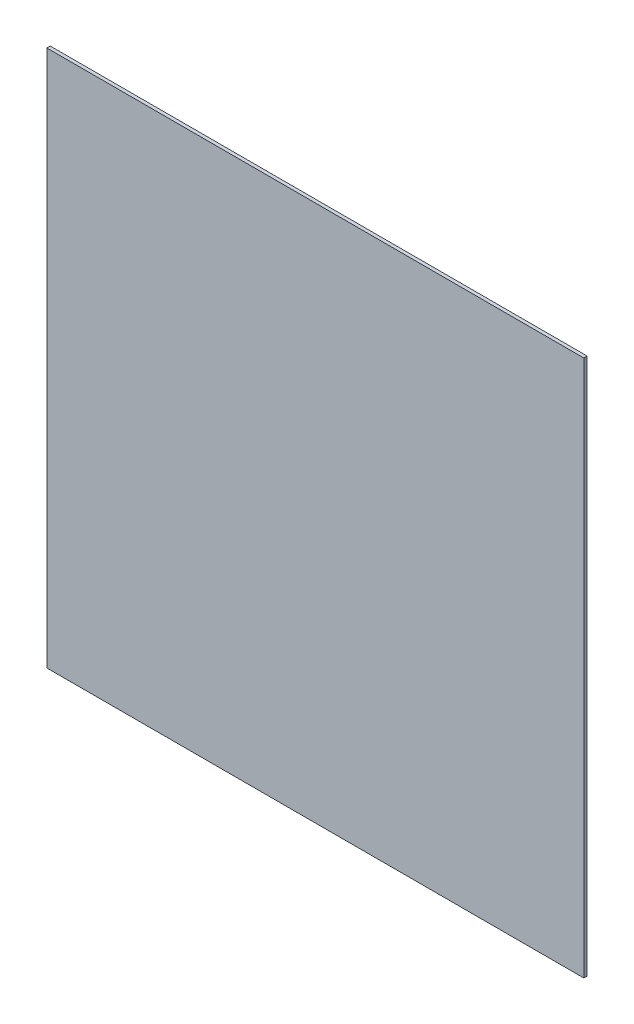
ISO-10303-21;
HEADER;
FILE_DESCRIPTION(('STEP AP214'),'2;1');
FILE_NAME('part.step','',(''),(''),'','','');
FILE_SCHEMA(('AUTOMOTIVE_DESIGN { 1 0 10303 214 1 1 1 1 }'));
ENDSEC;
DATA;
#1=APPLICATION_CONTEXT('core data for automotive mechanical design processes');
#2=APPLICATION_PROTOCOL_DEFINITION('international standard','automotive_design',2000,#1);
#3=PRODUCT_CONTEXT('',#1,'mechanical');
#4=PRODUCT('Part','Part','',(#3));
#5=PRODUCT_RELATED_PRODUCT_CATEGORY('part','',(#4));
#6=PRODUCT_DEFINITION_FORMATION('','',#4);
#7=PRODUCT_DEFINITION_CONTEXT('part definition',#1,'design');
#8=PRODUCT_DEFINITION('design','',#6,#7);
#9=PRODUCT_DEFINITION_SHAPE('','',#8);
#10=(LENGTH_UNIT() NAMED_UNIT(*) SI_UNIT(.MILLI.,.METRE.));
#11=(NAMED_UNIT(*) PLANE_ANGLE_UNIT() SI_UNIT($,.RADIAN.));
#12=(NAMED_UNIT(*) SI_UNIT($,.STERADIAN.) SOLID_ANGLE_UNIT());
#13=UNCERTAINTY_MEASURE_WITH_UNIT(LENGTH_MEASURE(1.E-05),#10,'distance_accuracy_value','');
#14=(GEOMETRIC_REPRESENTATION_CONTEXT(3) GLOBAL_UNCERTAINTY_ASSIGNED_CONTEXT((#13)) GLOBAL_UNIT_ASSIGNED_CONTEXT((#10,
#11,#12)) REPRESENTATION_CONTEXT('',''));
#15=CARTESIAN_POINT('',(0.,0.,0.));
#16=DIRECTION('',(0.,0.,1.));
#17=DIRECTION('',(1.,0.,0.));
#18=AXIS2_PLACEMENT_3D('',#15,#16,#17);
#19=CARTESIAN_POINT('',(-15.875,15.875,0.2));
#20=DIRECTION('',(1.,0.,0.));
#21=DIRECTION('',(0.,1.,0.));
#22=AXIS2_PLACEMENT_3D('',#19,#20,#21);
#23=PLANE('',#22);
#24=DIRECTION('',(0.,-1.,0.));
#25=VECTOR('',#24,1.);
#26=CARTESIAN_POINT('',(-15.875,15.875,0.));
#27=LINE('',#26,#25);
#28=CARTESIAN_POINT('',(-15.875,15.875,0.));
#29=VERTEX_POINT('',#28);
#30=CARTESIAN_POINT('',(-15.875,-15.875,0.));
#31=VERTEX_POINT('',#30);
#32=EDGE_CURVE('E98',#29,#31,#27,.T.);
#33=ORIENTED_EDGE('',*,*,#32,.T.);
#34=DIRECTION('',(0.,0.,-1.));
#35=VECTOR('',#34,1.);
#36=CARTESIAN_POINT('',(-15.875,-15.875,0.2));
#37=LINE('',#36,#35);
#38=CARTESIAN_POINT('',(-15.875,-15.875,0.2));
#39=VERTEX_POINT('',#38);
#40=EDGE_CURVE('E11',#39,#31,#37,.T.);
#41=ORIENTED_EDGE('',*,*,#40,.F.);
#42=DIRECTION('',(0.,-1.,0.));
#43=VECTOR('',#42,1.);
#44=CARTESIAN_POINT('',(-15.875,15.875,0.2));
#45=LINE('',#44,#43);
#46=CARTESIAN_POINT('',(-15.875,15.875,0.2));
#47=VERTEX_POINT('',#46);
#48=EDGE_CURVE('E86',#47,#39,#45,.T.);
#49=ORIENTED_EDGE('',*,*,#48,.F.);
#50=DIRECTION('',(0.,0.,-1.));
#51=VECTOR('',#50,1.);
#52=CARTESIAN_POINT('',(-15.875,15.875,0.2));
#53=LINE('',#52,#51);
#54=EDGE_CURVE('E94',#47,#29,#53,.T.);
#55=ORIENTED_EDGE('',*,*,#54,.T.);
#56=EDGE_LOOP('',(#33,#41,#49,#55));
#57=FACE_BOUND('',#56,.T.);
#58=ADVANCED_FACE('F35',(#57),#23,.F.);
#59=CARTESIAN_POINT('',(-15.875,-15.875,0.2));
#60=DIRECTION('',(0.,1.,0.));
#61=DIRECTION('',(0.,0.,1.));
#62=AXIS2_PLACEMENT_3D('',#59,#60,#61);
#63=PLANE('',#62);
#64=DIRECTION('',(1.,0.,0.));
#65=VECTOR('',#64,1.);
#66=CARTESIAN_POINT('',(-15.875,-15.875,0.));
#67=LINE('',#66,#65);
#68=CARTESIAN_POINT('',(15.875,-15.875,0.));
#69=VERTEX_POINT('',#68);
#70=EDGE_CURVE('E90',#31,#69,#67,.T.);
#71=ORIENTED_EDGE('',*,*,#70,.T.);
#72=DIRECTION('',(0.,0.,-1.));
#73=VECTOR('',#72,1.);
#74=CARTESIAN_POINT('',(15.875,-15.875,0.2));
#75=LINE('',#74,#73);
#76=CARTESIAN_POINT('',(15.875,-15.875,0.2));
#77=VERTEX_POINT('',#76);
#78=EDGE_CURVE('E43',#77,#69,#75,.T.);
#79=ORIENTED_EDGE('',*,*,#78,.F.);
#80=DIRECTION('',(1.,0.,0.));
#81=VECTOR('',#80,1.);
#82=CARTESIAN_POINT('',(-15.875,-15.875,0.2));
#83=LINE('',#82,#81);
#84=EDGE_CURVE('E81',#39,#77,#83,.T.);
#85=ORIENTED_EDGE('',*,*,#84,.F.);
#86=ORIENTED_EDGE('',*,*,#40,.T.);
#87=EDGE_LOOP('',(#71,#79,#85,#86));
#88=FACE_BOUND('',#87,.T.);
#89=ADVANCED_FACE('F89',(#88),#63,.F.);
#90=CARTESIAN_POINT('',(15.875,15.875,0.2));
#91=DIRECTION('',(-1.,0.,0.));
#92=DIRECTION('',(0.,0.,1.));
#93=AXIS2_PLACEMENT_3D('',#90,#91,#92);
#94=PLANE('',#93);
#95=DIRECTION('',(0.,1.,0.));
#96=VECTOR('',#95,1.);
#97=CARTESIAN_POINT('',(15.875,15.875,0.));
#98=LINE('',#97,#96);
#99=CARTESIAN_POINT('',(15.875,15.875,0.));
#100=VERTEX_POINT('',#99);
#101=EDGE_CURVE('E68',#69,#100,#98,.T.);
#102=ORIENTED_EDGE('',*,*,#101,.T.);
#103=DIRECTION('',(0.,0.,-1.));
#104=VECTOR('',#103,1.);
#105=CARTESIAN_POINT('',(15.875,15.875,0.2));
#106=LINE('',#105,#104);
#107=CARTESIAN_POINT('',(15.875,15.875,0.2));
#108=VERTEX_POINT('',#107);
#109=EDGE_CURVE('E91',#108,#100,#106,.T.);
#110=ORIENTED_EDGE('',*,*,#109,.F.);
#111=DIRECTION('',(0.,1.,0.));
#112=VECTOR('',#111,1.);
#113=CARTESIAN_POINT('',(15.875,15.875,0.2));
#114=LINE('',#113,#112);
#115=EDGE_CURVE('E84',#77,#108,#114,.T.);
#116=ORIENTED_EDGE('',*,*,#115,.F.);
#117=ORIENTED_EDGE('',*,*,#78,.T.);
#118=EDGE_LOOP('',(#102,#110,#116,#117));
#119=FACE_BOUND('',#118,.T.);
#120=ADVANCED_FACE('F92',(#119),#94,.F.);
#121=CARTESIAN_POINT('',(-15.875,15.875,0.2));
#122=DIRECTION('',(0.,-1.,0.));
#123=DIRECTION('',(0.,0.,-1.));
#124=AXIS2_PLACEMENT_3D('',#121,#122,#123);
#125=PLANE('',#124);
#126=DIRECTION('',(-1.,0.,0.));
#127=VECTOR('',#126,1.);
#128=CARTESIAN_POINT('',(-15.875,15.875,0.));
#129=LINE('',#128,#127);
#130=EDGE_CURVE('E74',#100,#29,#129,.T.);
#131=ORIENTED_EDGE('',*,*,#130,.T.);
#132=ORIENTED_EDGE('',*,*,#54,.F.);
#133=DIRECTION('',(-1.,0.,0.));
#134=VECTOR('',#133,1.);
#135=CARTESIAN_POINT('',(-15.875,15.875,0.2));
#136=LINE('',#135,#134);
#137=EDGE_CURVE('E51',#108,#47,#136,.T.);
#138=ORIENTED_EDGE('',*,*,#137,.F.);
#139=ORIENTED_EDGE('',*,*,#109,.T.);
#140=EDGE_LOOP('',(#131,#132,#138,#139));
#141=FACE_BOUND('',#140,.T.);
#142=ADVANCED_FACE('F105',(#141),#125,.F.);
#143=CARTESIAN_POINT('',(-15.875,-15.875,0.2));
#144=DIRECTION('',(0.,0.,1.));
#145=DIRECTION('',(1.,0.,0.));
#146=AXIS2_PLACEMENT_3D('',#143,#144,#145);
#147=PLANE('',#146);
#148=ORIENTED_EDGE('',*,*,#48,.T.);
#149=ORIENTED_EDGE('',*,*,#84,.T.);
#150=ORIENTED_EDGE('',*,*,#115,.T.);
#151=ORIENTED_EDGE('',*,*,#137,.T.);
#152=EDGE_LOOP('',(#148,#149,#150,#151));
#153=FACE_BOUND('',#152,.T.);
#154=ADVANCED_FACE('F82',(#153),#147,.T.);
#155=CARTESIAN_POINT('',(-15.875,-15.875,0.));
#156=DIRECTION('',(0.,0.,1.));
#157=DIRECTION('',(1.,0.,0.));
#158=AXIS2_PLACEMENT_3D('',#155,#156,#157);
#159=PLANE('',#158);
#160=ORIENTED_EDGE('',*,*,#32,.F.);
#161=ORIENTED_EDGE('',*,*,#130,.F.);
#162=ORIENTED_EDGE('',*,*,#101,.F.);
#163=ORIENTED_EDGE('',*,*,#70,.F.);
#164=EDGE_LOOP('',(#160,#161,#162,#163));
#165=FACE_BOUND('',#164,.T.);
#166=ADVANCED_FACE('F108',(#165),#159,.F.);
#167=CLOSED_SHELL('',(#58,#89,#120,#142,#154,#166));
#168=MANIFOLD_SOLID_BREP('B2',#167);
#169=ADVANCED_BREP_SHAPE_REPRESENTATION('',(#18,#168),#14);
#170=SHAPE_DEFINITION_REPRESENTATION(#9,#169);
ENDSEC;
END-ISO-10303-21;
